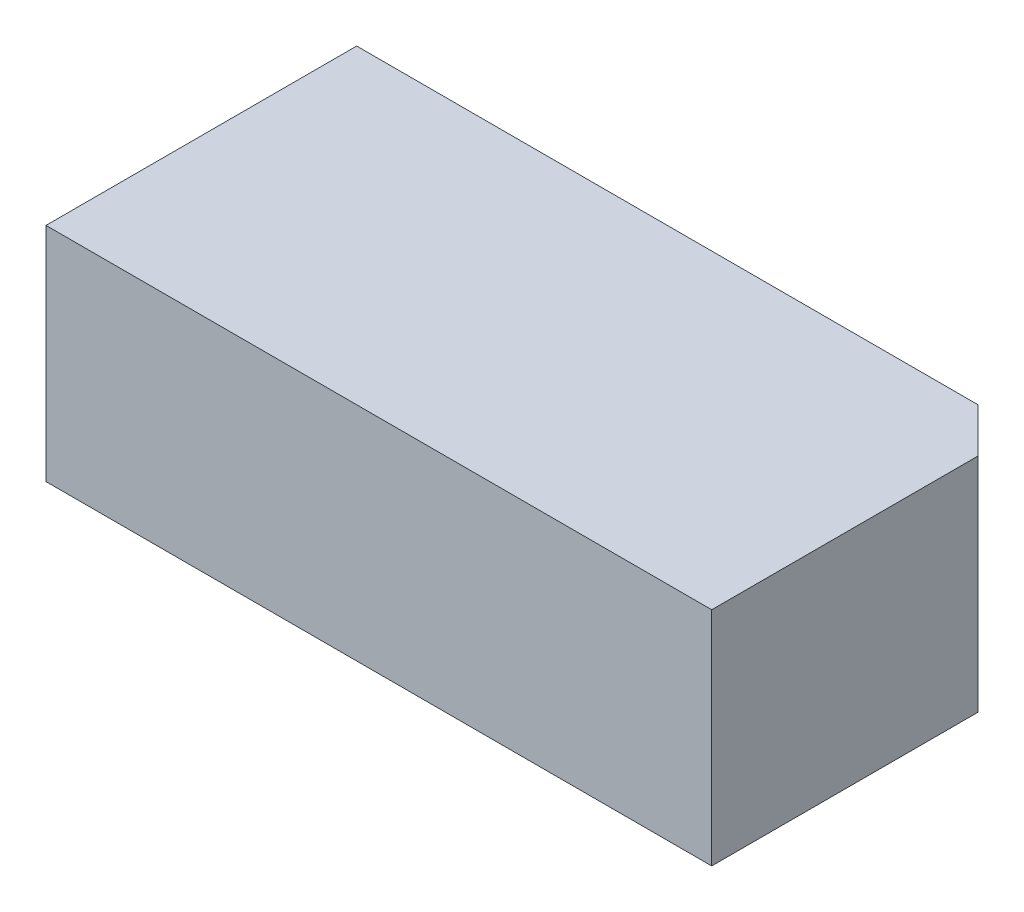
ISO-10303-21;
HEADER;
FILE_DESCRIPTION(('STEP AP214'),'2;1');
FILE_NAME('part.step','',(''),(''),'','','');
FILE_SCHEMA(('AUTOMOTIVE_DESIGN { 1 0 10303 214 1 1 1 1 }'));
ENDSEC;
DATA;
#1=APPLICATION_CONTEXT('core data for automotive mechanical design processes');
#2=APPLICATION_PROTOCOL_DEFINITION('international standard','automotive_design',2000,#1);
#3=PRODUCT_CONTEXT('',#1,'mechanical');
#4=PRODUCT('Part','Part','',(#3));
#5=PRODUCT_RELATED_PRODUCT_CATEGORY('part','',(#4));
#6=PRODUCT_DEFINITION_FORMATION('','',#4);
#7=PRODUCT_DEFINITION_CONTEXT('part definition',#1,'design');
#8=PRODUCT_DEFINITION('design','',#6,#7);
#9=PRODUCT_DEFINITION_SHAPE('','',#8);
#10=(LENGTH_UNIT() NAMED_UNIT(*) SI_UNIT(.MILLI.,.METRE.));
#11=(NAMED_UNIT(*) PLANE_ANGLE_UNIT() SI_UNIT($,.RADIAN.));
#12=(NAMED_UNIT(*) SI_UNIT($,.STERADIAN.) SOLID_ANGLE_UNIT());
#13=UNCERTAINTY_MEASURE_WITH_UNIT(LENGTH_MEASURE(1.E-05),#10,'distance_accuracy_value','');
#14=(GEOMETRIC_REPRESENTATION_CONTEXT(3) GLOBAL_UNCERTAINTY_ASSIGNED_CONTEXT((#13)) GLOBAL_UNIT_ASSIGNED_CONTEXT((#10,
#11,#12)) REPRESENTATION_CONTEXT('',''));
#15=CARTESIAN_POINT('',(0.,0.,0.));
#16=DIRECTION('',(0.,0.,1.));
#17=DIRECTION('',(1.,0.,0.));
#18=AXIS2_PLACEMENT_3D('',#15,#16,#17);
#19=CARTESIAN_POINT('',(1.52298850574712,3.01724137931034,7.));
#20=DIRECTION('',(-1.,0.,0.));
#21=DIRECTION('',(0.,-1.,0.));
#22=AXIS2_PLACEMENT_3D('',#19,#20,#21);
#23=PLANE('',#22);
#24=DIRECTION('',(0.,0.,-1.));
#25=VECTOR('',#24,1.);
#26=CARTESIAN_POINT('',(1.52298850574712,-1.98275862068966,7.));
#27=LINE('',#26,#25);
#28=CARTESIAN_POINT('',(1.52298850574712,-1.98275862068966,7.));
#29=VERTEX_POINT('',#28);
#30=CARTESIAN_POINT('',(1.52298850574712,-1.98275862068966,0.999999999999996));
#31=VERTEX_POINT('',#30);
#32=EDGE_CURVE('E116',#29,#31,#27,.T.);
#33=ORIENTED_EDGE('',*,*,#32,.T.);
#34=DIRECTION('',(0.,1.,0.));
#35=VECTOR('',#34,1.);
#36=CARTESIAN_POINT('',(1.52298850574712,3.01724137931034,0.999999999999996));
#37=LINE('',#36,#35);
#38=CARTESIAN_POINT('',(1.52298850574712,3.01724137931034,0.999999999999996));
#39=VERTEX_POINT('',#38);
#40=EDGE_CURVE('E107',#31,#39,#37,.T.);
#41=ORIENTED_EDGE('',*,*,#40,.T.);
#42=DIRECTION('',(0.,0.,-1.));
#43=VECTOR('',#42,1.);
#44=CARTESIAN_POINT('',(1.52298850574712,3.01724137931034,7.));
#45=LINE('',#44,#43);
#46=CARTESIAN_POINT('',(1.52298850574712,3.01724137931034,7.));
#47=VERTEX_POINT('',#46);
#48=EDGE_CURVE('E88',#47,#39,#45,.T.);
#49=ORIENTED_EDGE('',*,*,#48,.F.);
#50=DIRECTION('',(0.,1.,0.));
#51=VECTOR('',#50,1.);
#52=CARTESIAN_POINT('',(1.52298850574712,3.01724137931034,7.));
#53=LINE('',#52,#51);
#54=EDGE_CURVE('E94',#29,#47,#53,.T.);
#55=ORIENTED_EDGE('',*,*,#54,.F.);
#56=EDGE_LOOP('',(#33,#41,#49,#55));
#57=FACE_BOUND('',#56,.T.);
#58=ADVANCED_FACE('F39',(#57),#23,.F.);
#59=CARTESIAN_POINT('',(-13.4770114942529,3.01724137931034,7.));
#60=DIRECTION('',(0.,-1.,0.));
#61=DIRECTION('',(0.,0.,-1.));
#62=AXIS2_PLACEMENT_3D('',#59,#60,#61);
#63=PLANE('',#62);
#64=ORIENTED_EDGE('',*,*,#48,.T.);
#65=DIRECTION('',(0.707106781186549,0.,0.707106781186546));
#66=VECTOR('',#65,1.);
#67=CARTESIAN_POINT('',(1.52298850574712,3.01724137931034,0.999999999999996));
#68=LINE('',#67,#66);
#69=CARTESIAN_POINT('',(0.522988505747122,3.01724137931034,0.));
#70=VERTEX_POINT('',#69);
#71=EDGE_CURVE('E62',#39,#70,#68,.F.);
#72=ORIENTED_EDGE('',*,*,#71,.T.);
#73=DIRECTION('',(-1.,0.,0.));
#74=VECTOR('',#73,1.);
#75=CARTESIAN_POINT('',(-13.4770114942529,3.01724137931034,0.));
#76=LINE('',#75,#74);
#77=CARTESIAN_POINT('',(-13.4770114942529,3.01724137931034,0.));
#78=VERTEX_POINT('',#77);
#79=EDGE_CURVE('E121',#70,#78,#76,.T.);
#80=ORIENTED_EDGE('',*,*,#79,.T.);
#81=DIRECTION('',(0.,0.,-1.));
#82=VECTOR('',#81,1.);
#83=CARTESIAN_POINT('',(-13.4770114942529,3.01724137931034,7.));
#84=LINE('',#83,#82);
#85=CARTESIAN_POINT('',(-13.4770114942529,3.01724137931034,7.));
#86=VERTEX_POINT('',#85);
#87=EDGE_CURVE('E90',#86,#78,#84,.T.);
#88=ORIENTED_EDGE('',*,*,#87,.F.);
#89=DIRECTION('',(-1.,0.,0.));
#90=VECTOR('',#89,1.);
#91=CARTESIAN_POINT('',(-13.4770114942529,3.01724137931034,7.));
#92=LINE('',#91,#90);
#93=EDGE_CURVE('E84',#47,#86,#92,.T.);
#94=ORIENTED_EDGE('',*,*,#93,.F.);
#95=EDGE_LOOP('',(#64,#72,#80,#88,#94));
#96=FACE_BOUND('',#95,.T.);
#97=ADVANCED_FACE('F86',(#96),#63,.F.);
#98=CARTESIAN_POINT('',(-13.4770114942529,3.01724137931034,7.));
#99=DIRECTION('',(1.,0.,0.));
#100=DIRECTION('',(0.,0.,-1.));
#101=AXIS2_PLACEMENT_3D('',#98,#99,#100);
#102=PLANE('',#101);
#103=DIRECTION('',(0.,-1.,0.));
#104=VECTOR('',#103,1.);
#105=CARTESIAN_POINT('',(-13.4770114942529,3.01724137931034,0.));
#106=LINE('',#105,#104);
#107=CARTESIAN_POINT('',(-13.4770114942529,-1.98275862068966,0.));
#108=VERTEX_POINT('',#107);
#109=EDGE_CURVE('E119',#78,#108,#106,.T.);
#110=ORIENTED_EDGE('',*,*,#109,.T.);
#111=DIRECTION('',(0.,0.,-1.));
#112=VECTOR('',#111,1.);
#113=CARTESIAN_POINT('',(-13.4770114942529,-1.98275862068966,7.));
#114=LINE('',#113,#112);
#115=CARTESIAN_POINT('',(-13.4770114942529,-1.98275862068966,7.));
#116=VERTEX_POINT('',#115);
#117=EDGE_CURVE('E110',#116,#108,#114,.T.);
#118=ORIENTED_EDGE('',*,*,#117,.F.);
#119=DIRECTION('',(0.,-1.,0.));
#120=VECTOR('',#119,1.);
#121=CARTESIAN_POINT('',(-13.4770114942529,3.01724137931034,7.));
#122=LINE('',#121,#120);
#123=EDGE_CURVE('E93',#86,#116,#122,.T.);
#124=ORIENTED_EDGE('',*,*,#123,.F.);
#125=ORIENTED_EDGE('',*,*,#87,.T.);
#126=EDGE_LOOP('',(#110,#118,#124,#125));
#127=FACE_BOUND('',#126,.T.);
#128=ADVANCED_FACE('F126',(#127),#102,.F.);
#129=CARTESIAN_POINT('',(-13.4770114942529,-1.98275862068966,7.));
#130=DIRECTION('',(0.,1.,0.));
#131=DIRECTION('',(0.,0.,1.));
#132=AXIS2_PLACEMENT_3D('',#129,#130,#131);
#133=PLANE('',#132);
#134=DIRECTION('',(1.,0.,0.));
#135=VECTOR('',#134,1.);
#136=CARTESIAN_POINT('',(-13.4770114942529,-1.98275862068966,0.));
#137=LINE('',#136,#135);
#138=CARTESIAN_POINT('',(0.522988505747122,-1.98275862068966,0.));
#139=VERTEX_POINT('',#138);
#140=EDGE_CURVE('E103',#108,#139,#137,.T.);
#141=ORIENTED_EDGE('',*,*,#140,.T.);
#142=DIRECTION('',(-0.707106781186549,0.,-0.707106781186546));
#143=VECTOR('',#142,1.);
#144=CARTESIAN_POINT('',(1.52298850574712,-1.98275862068966,0.999999999999995));
#145=LINE('',#144,#143);
#146=EDGE_CURVE('E11',#139,#31,#145,.F.);
#147=ORIENTED_EDGE('',*,*,#146,.T.);
#148=ORIENTED_EDGE('',*,*,#32,.F.);
#149=DIRECTION('',(1.,0.,0.));
#150=VECTOR('',#149,1.);
#151=CARTESIAN_POINT('',(-13.4770114942529,-1.98275862068966,7.));
#152=LINE('',#151,#150);
#153=EDGE_CURVE('E99',#116,#29,#152,.T.);
#154=ORIENTED_EDGE('',*,*,#153,.F.);
#155=ORIENTED_EDGE('',*,*,#117,.T.);
#156=EDGE_LOOP('',(#141,#147,#148,#154,#155));
#157=FACE_BOUND('',#156,.T.);
#158=ADVANCED_FACE('F129',(#157),#133,.F.);
#159=CARTESIAN_POINT('',(0.,0.,7.));
#160=DIRECTION('',(0.,0.,1.));
#161=DIRECTION('',(1.,0.,0.));
#162=AXIS2_PLACEMENT_3D('',#159,#160,#161);
#163=PLANE('',#162);
#164=ORIENTED_EDGE('',*,*,#54,.T.);
#165=ORIENTED_EDGE('',*,*,#93,.T.);
#166=ORIENTED_EDGE('',*,*,#123,.T.);
#167=ORIENTED_EDGE('',*,*,#153,.T.);
#168=EDGE_LOOP('',(#164,#165,#166,#167));
#169=FACE_BOUND('',#168,.T.);
#170=ADVANCED_FACE('F97',(#169),#163,.T.);
#171=CARTESIAN_POINT('',(0.,0.,0.));
#172=DIRECTION('',(0.,0.,1.));
#173=DIRECTION('',(1.,0.,0.));
#174=AXIS2_PLACEMENT_3D('',#171,#172,#173);
#175=PLANE('',#174);
#176=ORIENTED_EDGE('',*,*,#79,.F.);
#177=DIRECTION('',(0.,-1.,0.));
#178=VECTOR('',#177,1.);
#179=CARTESIAN_POINT('',(0.522988505747122,0.,0.));
#180=LINE('',#179,#178);
#181=EDGE_CURVE('E48',#70,#139,#180,.T.);
#182=ORIENTED_EDGE('',*,*,#181,.T.);
#183=ORIENTED_EDGE('',*,*,#140,.F.);
#184=ORIENTED_EDGE('',*,*,#109,.F.);
#185=EDGE_LOOP('',(#176,#182,#183,#184));
#186=FACE_BOUND('',#185,.T.);
#187=ADVANCED_FACE('F133',(#186),#175,.F.);
#188=CARTESIAN_POINT('',(1.52298850574712,3.01724137931034,0.999999999999996));
#189=DIRECTION('',(-0.707106781186546,0.,0.707106781186549));
#190=DIRECTION('',(0.,1.,0.));
#191=AXIS2_PLACEMENT_3D('',#188,#189,#190);
#192=PLANE('',#191);
#193=ORIENTED_EDGE('',*,*,#146,.F.);
#194=ORIENTED_EDGE('',*,*,#181,.F.);
#195=ORIENTED_EDGE('',*,*,#71,.F.);
#196=ORIENTED_EDGE('',*,*,#40,.F.);
#197=EDGE_LOOP('',(#193,#194,#195,#196));
#198=FACE_BOUND('',#197,.T.);
#199=ADVANCED_FACE('F42',(#198),#192,.F.);
#200=CLOSED_SHELL('',(#58,#97,#128,#158,#170,#187,#199));
#201=MANIFOLD_SOLID_BREP('B2',#200);
#202=ADVANCED_BREP_SHAPE_REPRESENTATION('',(#18,#201),#14);
#203=SHAPE_DEFINITION_REPRESENTATION(#9,#202);
ENDSEC;
END-ISO-10303-21;
